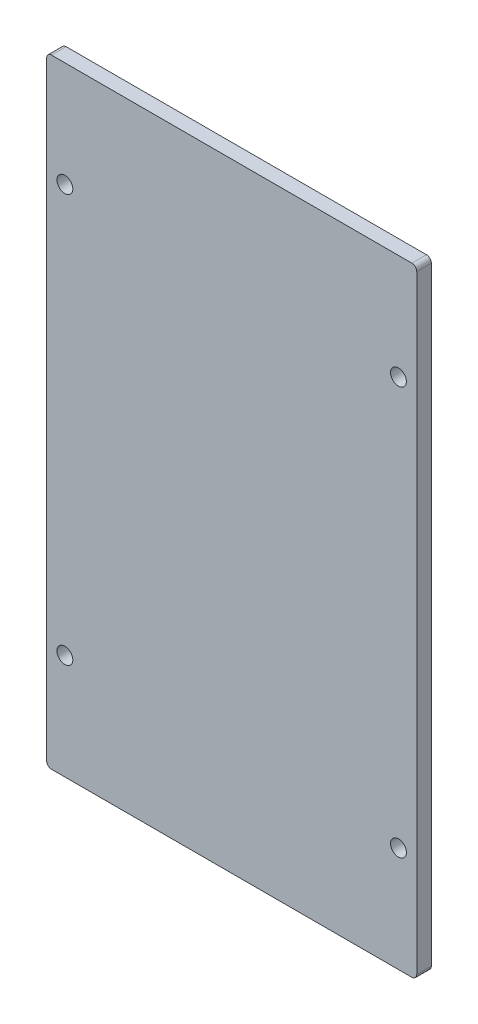
ISO-10303-21;
HEADER;
FILE_DESCRIPTION(('STEP AP214'),'2;1');
FILE_NAME('part.step','',(''),(''),'','','');
FILE_SCHEMA(('AUTOMOTIVE_DESIGN { 1 0 10303 214 1 1 1 1 }'));
ENDSEC;
DATA;
#1=APPLICATION_CONTEXT('core data for automotive mechanical design processes');
#2=APPLICATION_PROTOCOL_DEFINITION('international standard','automotive_design',2000,#1);
#3=PRODUCT_CONTEXT('',#1,'mechanical');
#4=PRODUCT('Part','Part','',(#3));
#5=PRODUCT_RELATED_PRODUCT_CATEGORY('part','',(#4));
#6=PRODUCT_DEFINITION_FORMATION('','',#4);
#7=PRODUCT_DEFINITION_CONTEXT('part definition',#1,'design');
#8=PRODUCT_DEFINITION('design','',#6,#7);
#9=PRODUCT_DEFINITION_SHAPE('','',#8);
#10=(LENGTH_UNIT() NAMED_UNIT(*) SI_UNIT(.MILLI.,.METRE.));
#11=(NAMED_UNIT(*) PLANE_ANGLE_UNIT() SI_UNIT($,.RADIAN.));
#12=(NAMED_UNIT(*) SI_UNIT($,.STERADIAN.) SOLID_ANGLE_UNIT());
#13=UNCERTAINTY_MEASURE_WITH_UNIT(LENGTH_MEASURE(1.E-05),#10,'distance_accuracy_value','');
#14=(GEOMETRIC_REPRESENTATION_CONTEXT(3) GLOBAL_UNCERTAINTY_ASSIGNED_CONTEXT((#13)) GLOBAL_UNIT_ASSIGNED_CONTEXT((#10,
#11,#12)) REPRESENTATION_CONTEXT('',''));
#15=CARTESIAN_POINT('',(0.,0.,0.));
#16=DIRECTION('',(0.,0.,1.));
#17=DIRECTION('',(1.,0.,0.));
#18=AXIS2_PLACEMENT_3D('',#15,#16,#17);
#19=CARTESIAN_POINT('',(0.,0.,3.));
#20=DIRECTION('',(0.,0.,-1.));
#21=DIRECTION('',(-1.,0.,0.));
#22=AXIS2_PLACEMENT_3D('',#19,#20,#21);
#23=PLANE('',#22);
#24=DIRECTION('',(0.,-1.,0.));
#25=VECTOR('',#24,1.);
#26=CARTESIAN_POINT('',(0.,0.,3.));
#27=LINE('',#26,#25);
#28=CARTESIAN_POINT('',(0.,126.,3.));
#29=VERTEX_POINT('',#28);
#30=CARTESIAN_POINT('',(0.,1.,3.));
#31=VERTEX_POINT('',#30);
#32=EDGE_CURVE('E137',#29,#31,#27,.T.);
#33=ORIENTED_EDGE('',*,*,#32,.T.);
#34=CARTESIAN_POINT('',(1.,1.,3.));
#35=DIRECTION('',(0.,0.,-1.));
#36=DIRECTION('',(-1.,0.,0.));
#37=AXIS2_PLACEMENT_3D('',#34,#35,#36);
#38=CIRCLE('',#37,1.);
#39=CARTESIAN_POINT('',(1.,0.,3.));
#40=VERTEX_POINT('',#39);
#41=EDGE_CURVE('E152',#31,#40,#38,.F.);
#42=ORIENTED_EDGE('',*,*,#41,.T.);
#43=DIRECTION('',(1.,0.,0.));
#44=VECTOR('',#43,1.);
#45=CARTESIAN_POINT('',(0.,0.,3.));
#46=LINE('',#45,#44);
#47=CARTESIAN_POINT('',(75.,0.,3.));
#48=VERTEX_POINT('',#47);
#49=EDGE_CURVE('E119',#40,#48,#46,.T.);
#50=ORIENTED_EDGE('',*,*,#49,.T.);
#51=CARTESIAN_POINT('',(75.,1.,3.));
#52=DIRECTION('',(0.,0.,-1.));
#53=DIRECTION('',(-1.,0.,0.));
#54=AXIS2_PLACEMENT_3D('',#51,#52,#53);
#55=CIRCLE('',#54,1.);
#56=CARTESIAN_POINT('',(76.,1.,3.));
#57=VERTEX_POINT('',#56);
#58=EDGE_CURVE('E150',#48,#57,#55,.F.);
#59=ORIENTED_EDGE('',*,*,#58,.T.);
#60=DIRECTION('',(0.,1.,0.));
#61=VECTOR('',#60,1.);
#62=CARTESIAN_POINT('',(76.,0.,3.));
#63=LINE('',#62,#61);
#64=CARTESIAN_POINT('',(76.,126.,3.));
#65=VERTEX_POINT('',#64);
#66=EDGE_CURVE('E163',#57,#65,#63,.T.);
#67=ORIENTED_EDGE('',*,*,#66,.T.);
#68=CARTESIAN_POINT('',(75.,126.,3.));
#69=DIRECTION('',(0.,0.,-1.));
#70=DIRECTION('',(-1.,0.,0.));
#71=AXIS2_PLACEMENT_3D('',#68,#69,#70);
#72=CIRCLE('',#71,1.);
#73=CARTESIAN_POINT('',(75.,127.,3.));
#74=VERTEX_POINT('',#73);
#75=EDGE_CURVE('E54',#65,#74,#72,.F.);
#76=ORIENTED_EDGE('',*,*,#75,.T.);
#77=DIRECTION('',(-1.,0.,0.));
#78=VECTOR('',#77,1.);
#79=CARTESIAN_POINT('',(0.,127.,3.));
#80=LINE('',#79,#78);
#81=CARTESIAN_POINT('',(1.,127.,3.));
#82=VERTEX_POINT('',#81);
#83=EDGE_CURVE('E138',#74,#82,#80,.T.);
#84=ORIENTED_EDGE('',*,*,#83,.T.);
#85=CARTESIAN_POINT('',(1.,126.,3.));
#86=DIRECTION('',(0.,0.,-1.));
#87=DIRECTION('',(-1.,0.,0.));
#88=AXIS2_PLACEMENT_3D('',#85,#86,#87);
#89=CIRCLE('',#88,1.);
#90=EDGE_CURVE('E147',#82,#29,#89,.F.);
#91=ORIENTED_EDGE('',*,*,#90,.T.);
#92=EDGE_LOOP('',(#33,#42,#50,#59,#67,#76,#84,#91));
#93=FACE_BOUND('',#92,.T.);
#94=CARTESIAN_POINT('',(3.75000000000001,105.375,3.));
#95=DIRECTION('',(0.,0.,1.));
#96=DIRECTION('',(1.,0.,0.));
#97=AXIS2_PLACEMENT_3D('',#94,#95,#96);
#98=CIRCLE('',#97,1.625);
#99=CARTESIAN_POINT('',(5.37500000000001,105.375,3.));
#100=VERTEX_POINT('',#99);
#101=EDGE_CURVE('E132',#100,#100,#98,.T.);
#102=ORIENTED_EDGE('',*,*,#101,.F.);
#103=EDGE_LOOP('',(#102));
#104=FACE_BOUND('',#103,.T.);
#105=CARTESIAN_POINT('',(72.25,105.375,3.));
#106=DIRECTION('',(0.,0.,1.));
#107=DIRECTION('',(1.,0.,0.));
#108=AXIS2_PLACEMENT_3D('',#105,#106,#107);
#109=CIRCLE('',#108,1.625);
#110=CARTESIAN_POINT('',(73.875,105.375,3.));
#111=VERTEX_POINT('',#110);
#112=EDGE_CURVE('E180',#111,#111,#109,.T.);
#113=ORIENTED_EDGE('',*,*,#112,.F.);
#114=EDGE_LOOP('',(#113));
#115=FACE_BOUND('',#114,.T.);
#116=CARTESIAN_POINT('',(72.25,21.625,3.));
#117=DIRECTION('',(0.,0.,1.));
#118=DIRECTION('',(1.,0.,0.));
#119=AXIS2_PLACEMENT_3D('',#116,#117,#118);
#120=CIRCLE('',#119,1.625);
#121=CARTESIAN_POINT('',(73.875,21.625,3.));
#122=VERTEX_POINT('',#121);
#123=EDGE_CURVE('E186',#122,#122,#120,.T.);
#124=ORIENTED_EDGE('',*,*,#123,.F.);
#125=EDGE_LOOP('',(#124));
#126=FACE_BOUND('',#125,.T.);
#127=CARTESIAN_POINT('',(3.75000000000001,21.625,3.));
#128=DIRECTION('',(0.,0.,1.));
#129=DIRECTION('',(1.,0.,0.));
#130=AXIS2_PLACEMENT_3D('',#127,#128,#129);
#131=CIRCLE('',#130,1.625);
#132=CARTESIAN_POINT('',(5.37500000000001,21.625,3.));
#133=VERTEX_POINT('',#132);
#134=EDGE_CURVE('E192',#133,#133,#131,.T.);
#135=ORIENTED_EDGE('',*,*,#134,.F.);
#136=EDGE_LOOP('',(#135));
#137=FACE_BOUND('',#136,.T.);
#138=ADVANCED_FACE('F33',(#93,#104,#115,#126,#137),#23,.F.);
#139=CARTESIAN_POINT('',(0.,0.,0.));
#140=DIRECTION('',(0.,0.,-1.));
#141=DIRECTION('',(-1.,0.,0.));
#142=AXIS2_PLACEMENT_3D('',#139,#140,#141);
#143=PLANE('',#142);
#144=CARTESIAN_POINT('',(72.25,21.625,0.));
#145=DIRECTION('',(0.,0.,1.));
#146=DIRECTION('',(1.,0.,0.));
#147=AXIS2_PLACEMENT_3D('',#144,#145,#146);
#148=CIRCLE('',#147,1.625);
#149=CARTESIAN_POINT('',(73.875,21.625,0.));
#150=VERTEX_POINT('',#149);
#151=EDGE_CURVE('E189',#150,#150,#148,.T.);
#152=ORIENTED_EDGE('',*,*,#151,.T.);
#153=EDGE_LOOP('',(#152));
#154=FACE_BOUND('',#153,.T.);
#155=CARTESIAN_POINT('',(3.75000000000001,105.375,0.));
#156=DIRECTION('',(0.,0.,1.));
#157=DIRECTION('',(1.,0.,0.));
#158=AXIS2_PLACEMENT_3D('',#155,#156,#157);
#159=CIRCLE('',#158,1.625);
#160=CARTESIAN_POINT('',(5.37500000000001,105.375,0.));
#161=VERTEX_POINT('',#160);
#162=EDGE_CURVE('E177',#161,#161,#159,.T.);
#163=ORIENTED_EDGE('',*,*,#162,.T.);
#164=EDGE_LOOP('',(#163));
#165=FACE_BOUND('',#164,.T.);
#166=DIRECTION('',(1.,0.,0.));
#167=VECTOR('',#166,1.);
#168=CARTESIAN_POINT('',(0.,0.,0.));
#169=LINE('',#168,#167);
#170=CARTESIAN_POINT('',(1.,0.,0.));
#171=VERTEX_POINT('',#170);
#172=CARTESIAN_POINT('',(75.,0.,0.));
#173=VERTEX_POINT('',#172);
#174=EDGE_CURVE('E116',#171,#173,#169,.T.);
#175=ORIENTED_EDGE('',*,*,#174,.F.);
#176=CARTESIAN_POINT('',(1.,1.,0.));
#177=DIRECTION('',(0.,0.,-1.));
#178=DIRECTION('',(-1.,0.,0.));
#179=AXIS2_PLACEMENT_3D('',#176,#177,#178);
#180=CIRCLE('',#179,1.);
#181=CARTESIAN_POINT('',(0.,1.,0.));
#182=VERTEX_POINT('',#181);
#183=EDGE_CURVE('E99',#171,#182,#180,.T.);
#184=ORIENTED_EDGE('',*,*,#183,.T.);
#185=DIRECTION('',(0.,-1.,0.));
#186=VECTOR('',#185,1.);
#187=CARTESIAN_POINT('',(0.,0.,0.));
#188=LINE('',#187,#186);
#189=CARTESIAN_POINT('',(0.,126.,0.));
#190=VERTEX_POINT('',#189);
#191=EDGE_CURVE('E127',#190,#182,#188,.T.);
#192=ORIENTED_EDGE('',*,*,#191,.F.);
#193=CARTESIAN_POINT('',(1.,126.,0.));
#194=DIRECTION('',(0.,0.,-1.));
#195=DIRECTION('',(-1.,0.,0.));
#196=AXIS2_PLACEMENT_3D('',#193,#194,#195);
#197=CIRCLE('',#196,1.);
#198=CARTESIAN_POINT('',(1.,127.,0.));
#199=VERTEX_POINT('',#198);
#200=EDGE_CURVE('E120',#190,#199,#197,.T.);
#201=ORIENTED_EDGE('',*,*,#200,.T.);
#202=DIRECTION('',(-1.,0.,0.));
#203=VECTOR('',#202,1.);
#204=CARTESIAN_POINT('',(0.,127.,0.));
#205=LINE('',#204,#203);
#206=CARTESIAN_POINT('',(75.,127.,0.));
#207=VERTEX_POINT('',#206);
#208=EDGE_CURVE('E130',#207,#199,#205,.T.);
#209=ORIENTED_EDGE('',*,*,#208,.F.);
#210=CARTESIAN_POINT('',(75.,126.,0.));
#211=DIRECTION('',(0.,0.,-1.));
#212=DIRECTION('',(-1.,0.,0.));
#213=AXIS2_PLACEMENT_3D('',#210,#211,#212);
#214=CIRCLE('',#213,1.);
#215=CARTESIAN_POINT('',(76.,126.,0.));
#216=VERTEX_POINT('',#215);
#217=EDGE_CURVE('E141',#207,#216,#214,.T.);
#218=ORIENTED_EDGE('',*,*,#217,.T.);
#219=DIRECTION('',(0.,1.,0.));
#220=VECTOR('',#219,1.);
#221=CARTESIAN_POINT('',(76.,0.,0.));
#222=LINE('',#221,#220);
#223=CARTESIAN_POINT('',(76.,1.,0.));
#224=VERTEX_POINT('',#223);
#225=EDGE_CURVE('E126',#224,#216,#222,.T.);
#226=ORIENTED_EDGE('',*,*,#225,.F.);
#227=CARTESIAN_POINT('',(75.,1.,0.));
#228=DIRECTION('',(0.,0.,-1.));
#229=DIRECTION('',(-1.,0.,0.));
#230=AXIS2_PLACEMENT_3D('',#227,#228,#229);
#231=CIRCLE('',#230,1.);
#232=EDGE_CURVE('E110',#224,#173,#231,.T.);
#233=ORIENTED_EDGE('',*,*,#232,.T.);
#234=EDGE_LOOP('',(#175,#184,#192,#201,#209,#218,#226,#233));
#235=FACE_BOUND('',#234,.T.);
#236=CARTESIAN_POINT('',(72.25,105.375,0.));
#237=DIRECTION('',(0.,0.,1.));
#238=DIRECTION('',(1.,0.,0.));
#239=AXIS2_PLACEMENT_3D('',#236,#237,#238);
#240=CIRCLE('',#239,1.625);
#241=CARTESIAN_POINT('',(73.875,105.375,0.));
#242=VERTEX_POINT('',#241);
#243=EDGE_CURVE('E183',#242,#242,#240,.T.);
#244=ORIENTED_EDGE('',*,*,#243,.T.);
#245=EDGE_LOOP('',(#244));
#246=FACE_BOUND('',#245,.T.);
#247=CARTESIAN_POINT('',(3.75000000000001,21.625,0.));
#248=DIRECTION('',(0.,0.,1.));
#249=DIRECTION('',(1.,0.,0.));
#250=AXIS2_PLACEMENT_3D('',#247,#248,#249);
#251=CIRCLE('',#250,1.625);
#252=CARTESIAN_POINT('',(5.37500000000001,21.625,0.));
#253=VERTEX_POINT('',#252);
#254=EDGE_CURVE('E195',#253,#253,#251,.T.);
#255=ORIENTED_EDGE('',*,*,#254,.T.);
#256=EDGE_LOOP('',(#255));
#257=FACE_BOUND('',#256,.T.);
#258=ADVANCED_FACE('F123',(#154,#165,#235,#246,#257),#143,.T.);
#259=CARTESIAN_POINT('',(0.,0.,3.));
#260=DIRECTION('',(1.,0.,0.));
#261=DIRECTION('',(0.,0.,-1.));
#262=AXIS2_PLACEMENT_3D('',#259,#260,#261);
#263=PLANE('',#262);
#264=ORIENTED_EDGE('',*,*,#191,.T.);
#265=DIRECTION('',(0.,0.,-1.));
#266=VECTOR('',#265,1.);
#267=CARTESIAN_POINT('',(0.,1.,3.));
#268=LINE('',#267,#266);
#269=EDGE_CURVE('E104',#182,#31,#268,.F.);
#270=ORIENTED_EDGE('',*,*,#269,.T.);
#271=ORIENTED_EDGE('',*,*,#32,.F.);
#272=DIRECTION('',(0.,0.,-1.));
#273=VECTOR('',#272,1.);
#274=CARTESIAN_POINT('',(0.,126.,3.));
#275=LINE('',#274,#273);
#276=EDGE_CURVE('E109',#29,#190,#275,.T.);
#277=ORIENTED_EDGE('',*,*,#276,.T.);
#278=EDGE_LOOP('',(#264,#270,#271,#277));
#279=FACE_BOUND('',#278,.T.);
#280=ADVANCED_FACE('F209',(#279),#263,.F.);
#281=CARTESIAN_POINT('',(0.,0.,3.));
#282=DIRECTION('',(0.,1.,0.));
#283=DIRECTION('',(0.,0.,1.));
#284=AXIS2_PLACEMENT_3D('',#281,#282,#283);
#285=PLANE('',#284);
#286=ORIENTED_EDGE('',*,*,#49,.F.);
#287=DIRECTION('',(0.,0.,-1.));
#288=VECTOR('',#287,1.);
#289=CARTESIAN_POINT('',(1.,0.,3.));
#290=LINE('',#289,#288);
#291=EDGE_CURVE('E103',#40,#171,#290,.T.);
#292=ORIENTED_EDGE('',*,*,#291,.T.);
#293=ORIENTED_EDGE('',*,*,#174,.T.);
#294=DIRECTION('',(0.,0.,-1.));
#295=VECTOR('',#294,1.);
#296=CARTESIAN_POINT('',(75.,0.,3.));
#297=LINE('',#296,#295);
#298=EDGE_CURVE('E121',#173,#48,#297,.F.);
#299=ORIENTED_EDGE('',*,*,#298,.T.);
#300=EDGE_LOOP('',(#286,#292,#293,#299));
#301=FACE_BOUND('',#300,.T.);
#302=ADVANCED_FACE('F115',(#301),#285,.F.);
#303=CARTESIAN_POINT('',(76.,0.,3.));
#304=DIRECTION('',(-1.,0.,0.));
#305=DIRECTION('',(0.,0.,1.));
#306=AXIS2_PLACEMENT_3D('',#303,#304,#305);
#307=PLANE('',#306);
#308=ORIENTED_EDGE('',*,*,#66,.F.);
#309=DIRECTION('',(0.,0.,-1.));
#310=VECTOR('',#309,1.);
#311=CARTESIAN_POINT('',(76.,1.,3.));
#312=LINE('',#311,#310);
#313=EDGE_CURVE('E156',#57,#224,#312,.T.);
#314=ORIENTED_EDGE('',*,*,#313,.T.);
#315=ORIENTED_EDGE('',*,*,#225,.T.);
#316=DIRECTION('',(0.,0.,-1.));
#317=VECTOR('',#316,1.);
#318=CARTESIAN_POINT('',(76.,126.,3.));
#319=LINE('',#318,#317);
#320=EDGE_CURVE('E154',#216,#65,#319,.F.);
#321=ORIENTED_EDGE('',*,*,#320,.T.);
#322=EDGE_LOOP('',(#308,#314,#315,#321));
#323=FACE_BOUND('',#322,.T.);
#324=ADVANCED_FACE('F161',(#323),#307,.F.);
#325=CARTESIAN_POINT('',(0.,127.,3.));
#326=DIRECTION('',(0.,-1.,0.));
#327=DIRECTION('',(0.,0.,-1.));
#328=AXIS2_PLACEMENT_3D('',#325,#326,#327);
#329=PLANE('',#328);
#330=ORIENTED_EDGE('',*,*,#83,.F.);
#331=DIRECTION('',(0.,0.,-1.));
#332=VECTOR('',#331,1.);
#333=CARTESIAN_POINT('',(75.,127.,3.));
#334=LINE('',#333,#332);
#335=EDGE_CURVE('E11',#74,#207,#334,.T.);
#336=ORIENTED_EDGE('',*,*,#335,.T.);
#337=ORIENTED_EDGE('',*,*,#208,.T.);
#338=DIRECTION('',(0.,0.,-1.));
#339=VECTOR('',#338,1.);
#340=CARTESIAN_POINT('',(1.,127.,3.));
#341=LINE('',#340,#339);
#342=EDGE_CURVE('E41',#199,#82,#341,.F.);
#343=ORIENTED_EDGE('',*,*,#342,.T.);
#344=EDGE_LOOP('',(#330,#336,#337,#343));
#345=FACE_BOUND('',#344,.T.);
#346=ADVANCED_FACE('F170',(#345),#329,.F.);
#347=CARTESIAN_POINT('',(3.75000000000001,105.375,3.));
#348=DIRECTION('',(0.,0.,-1.));
#349=DIRECTION('',(-1.,0.,0.));
#350=AXIS2_PLACEMENT_3D('',#347,#348,#349);
#351=CYLINDRICAL_SURFACE('',#350,1.625);
#352=ORIENTED_EDGE('',*,*,#101,.T.);
#353=EDGE_LOOP('',(#352));
#354=FACE_BOUND('',#353,.T.);
#355=ORIENTED_EDGE('',*,*,#162,.F.);
#356=EDGE_LOOP('',(#355));
#357=FACE_BOUND('',#356,.T.);
#358=ADVANCED_FACE('F214',(#354,#357),#351,.F.);
#359=CARTESIAN_POINT('',(72.25,105.375,3.));
#360=DIRECTION('',(0.,0.,-1.));
#361=DIRECTION('',(-1.,0.,0.));
#362=AXIS2_PLACEMENT_3D('',#359,#360,#361);
#363=CYLINDRICAL_SURFACE('',#362,1.625);
#364=ORIENTED_EDGE('',*,*,#112,.T.);
#365=EDGE_LOOP('',(#364));
#366=FACE_BOUND('',#365,.T.);
#367=ORIENTED_EDGE('',*,*,#243,.F.);
#368=EDGE_LOOP('',(#367));
#369=FACE_BOUND('',#368,.T.);
#370=ADVANCED_FACE('F309',(#366,#369),#363,.F.);
#371=CARTESIAN_POINT('',(72.25,21.625,3.));
#372=DIRECTION('',(0.,0.,-1.));
#373=DIRECTION('',(-1.,0.,0.));
#374=AXIS2_PLACEMENT_3D('',#371,#372,#373);
#375=CYLINDRICAL_SURFACE('',#374,1.625);
#376=ORIENTED_EDGE('',*,*,#123,.T.);
#377=EDGE_LOOP('',(#376));
#378=FACE_BOUND('',#377,.T.);
#379=ORIENTED_EDGE('',*,*,#151,.F.);
#380=EDGE_LOOP('',(#379));
#381=FACE_BOUND('',#380,.T.);
#382=ADVANCED_FACE('F300',(#378,#381),#375,.F.);
#383=CARTESIAN_POINT('',(3.75000000000001,21.625,3.));
#384=DIRECTION('',(0.,0.,-1.));
#385=DIRECTION('',(-1.,0.,0.));
#386=AXIS2_PLACEMENT_3D('',#383,#384,#385);
#387=CYLINDRICAL_SURFACE('',#386,1.625);
#388=ORIENTED_EDGE('',*,*,#134,.T.);
#389=EDGE_LOOP('',(#388));
#390=FACE_BOUND('',#389,.T.);
#391=ORIENTED_EDGE('',*,*,#254,.F.);
#392=EDGE_LOOP('',(#391));
#393=FACE_BOUND('',#392,.T.);
#394=ADVANCED_FACE('F201',(#390,#393),#387,.F.);
#395=CARTESIAN_POINT('',(1.,1.,3.));
#396=DIRECTION('',(0.,0.,-1.));
#397=DIRECTION('',(-1.,0.,0.));
#398=AXIS2_PLACEMENT_3D('',#395,#396,#397);
#399=CYLINDRICAL_SURFACE('',#398,1.);
#400=ORIENTED_EDGE('',*,*,#41,.F.);
#401=ORIENTED_EDGE('',*,*,#269,.F.);
#402=ORIENTED_EDGE('',*,*,#183,.F.);
#403=ORIENTED_EDGE('',*,*,#291,.F.);
#404=EDGE_LOOP('',(#400,#401,#402,#403));
#405=FACE_BOUND('',#404,.T.);
#406=ADVANCED_FACE('F102',(#405),#399,.T.);
#407=CARTESIAN_POINT('',(75.,1.,3.));
#408=DIRECTION('',(0.,0.,-1.));
#409=DIRECTION('',(-1.,0.,0.));
#410=AXIS2_PLACEMENT_3D('',#407,#408,#409);
#411=CYLINDRICAL_SURFACE('',#410,1.);
#412=ORIENTED_EDGE('',*,*,#58,.F.);
#413=ORIENTED_EDGE('',*,*,#298,.F.);
#414=ORIENTED_EDGE('',*,*,#232,.F.);
#415=ORIENTED_EDGE('',*,*,#313,.F.);
#416=EDGE_LOOP('',(#412,#413,#414,#415));
#417=FACE_BOUND('',#416,.T.);
#418=ADVANCED_FACE('F228',(#417),#411,.T.);
#419=CARTESIAN_POINT('',(75.,126.,3.));
#420=DIRECTION('',(0.,0.,-1.));
#421=DIRECTION('',(-1.,0.,0.));
#422=AXIS2_PLACEMENT_3D('',#419,#420,#421);
#423=CYLINDRICAL_SURFACE('',#422,1.);
#424=ORIENTED_EDGE('',*,*,#75,.F.);
#425=ORIENTED_EDGE('',*,*,#320,.F.);
#426=ORIENTED_EDGE('',*,*,#217,.F.);
#427=ORIENTED_EDGE('',*,*,#335,.F.);
#428=EDGE_LOOP('',(#424,#425,#426,#427));
#429=FACE_BOUND('',#428,.T.);
#430=ADVANCED_FACE('F169',(#429),#423,.T.);
#431=CARTESIAN_POINT('',(1.,126.,3.));
#432=DIRECTION('',(0.,0.,-1.));
#433=DIRECTION('',(-1.,0.,0.));
#434=AXIS2_PLACEMENT_3D('',#431,#432,#433);
#435=CYLINDRICAL_SURFACE('',#434,1.);
#436=ORIENTED_EDGE('',*,*,#90,.F.);
#437=ORIENTED_EDGE('',*,*,#342,.F.);
#438=ORIENTED_EDGE('',*,*,#200,.F.);
#439=ORIENTED_EDGE('',*,*,#276,.F.);
#440=EDGE_LOOP('',(#436,#437,#438,#439));
#441=FACE_BOUND('',#440,.T.);
#442=ADVANCED_FACE('F35',(#441),#435,.T.);
#443=CLOSED_SHELL('',(#138,#258,#280,#302,#324,#346,#358,#370,#382,#394,#406,#418,#430,#442));
#444=MANIFOLD_SOLID_BREP('B2',#443);
#445=ADVANCED_BREP_SHAPE_REPRESENTATION('',(#18,#444),#14);
#446=SHAPE_DEFINITION_REPRESENTATION(#9,#445);
ENDSEC;
END-ISO-10303-21;
